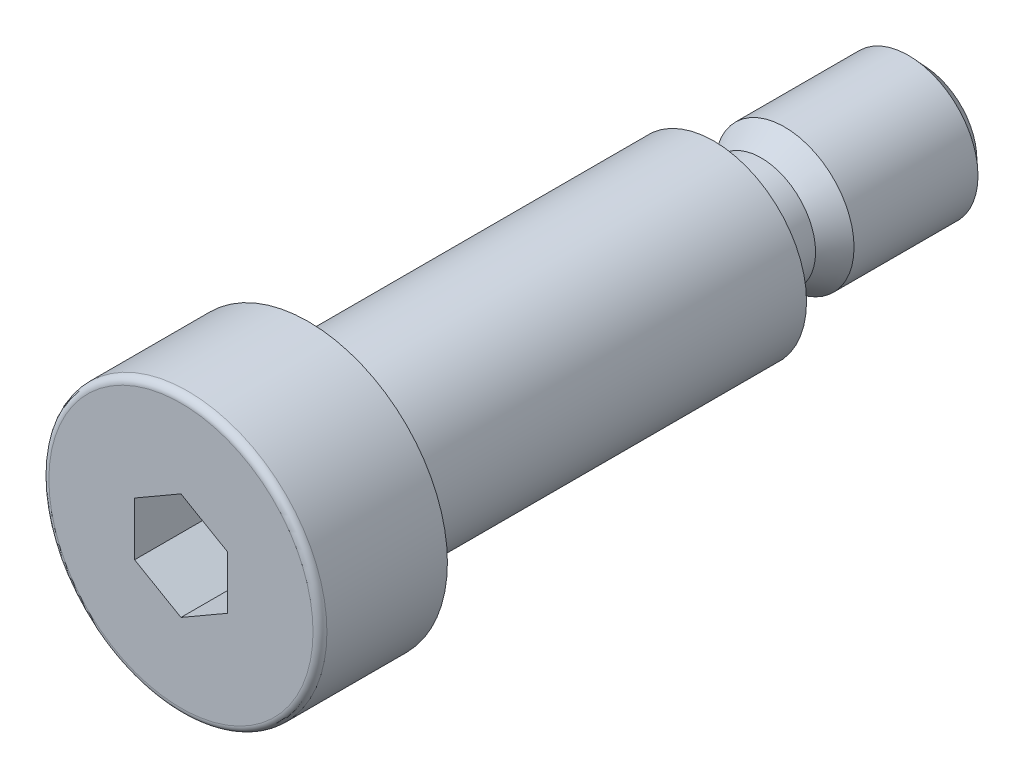
ISO-10303-21;
HEADER;
FILE_DESCRIPTION(('STEP AP214'),'2;1');
FILE_NAME('part.step','',(''),(''),'','','');
FILE_SCHEMA(('AUTOMOTIVE_DESIGN { 1 0 10303 214 1 1 1 1 }'));
ENDSEC;
DATA;
#1=APPLICATION_CONTEXT('core data for automotive mechanical design processes');
#2=APPLICATION_PROTOCOL_DEFINITION('international standard','automotive_design',2000,#1);
#3=PRODUCT_CONTEXT('',#1,'mechanical');
#4=PRODUCT('Part','Part','',(#3));
#5=PRODUCT_RELATED_PRODUCT_CATEGORY('part','',(#4));
#6=PRODUCT_DEFINITION_FORMATION('','',#4);
#7=PRODUCT_DEFINITION_CONTEXT('part definition',#1,'design');
#8=PRODUCT_DEFINITION('design','',#6,#7);
#9=PRODUCT_DEFINITION_SHAPE('','',#8);
#10=(LENGTH_UNIT() NAMED_UNIT(*) SI_UNIT(.MILLI.,.METRE.));
#11=(NAMED_UNIT(*) PLANE_ANGLE_UNIT() SI_UNIT($,.RADIAN.));
#12=(NAMED_UNIT(*) SI_UNIT($,.STERADIAN.) SOLID_ANGLE_UNIT());
#13=UNCERTAINTY_MEASURE_WITH_UNIT(LENGTH_MEASURE(1.E-05),#10,'distance_accuracy_value','');
#14=(GEOMETRIC_REPRESENTATION_CONTEXT(3) GLOBAL_UNCERTAINTY_ASSIGNED_CONTEXT((#13)) GLOBAL_UNIT_ASSIGNED_CONTEXT((#10,
#11,#12)) REPRESENTATION_CONTEXT('',''));
#15=CARTESIAN_POINT('',(0.,0.,0.));
#16=DIRECTION('',(0.,0.,1.));
#17=DIRECTION('',(1.,0.,0.));
#18=AXIS2_PLACEMENT_3D('',#15,#16,#17);
#19=CARTESIAN_POINT('',(0.,0.,28.5));
#20=DIRECTION('',(0.,0.,1.));
#21=DIRECTION('',(1.,0.,0.));
#22=AXIS2_PLACEMENT_3D('',#19,#20,#21);
#23=PLANE('',#22);
#24=CARTESIAN_POINT('',(0.,0.,28.5));
#25=DIRECTION('',(0.,0.,1.));
#26=DIRECTION('',(1.,0.,0.));
#27=AXIS2_PLACEMENT_3D('',#24,#25,#26);
#28=CIRCLE('',#27,11.4);
#29=CARTESIAN_POINT('',(11.4,0.,28.5));
#30=VERTEX_POINT('',#29);
#31=EDGE_CURVE('E42',#30,#30,#28,.T.);
#32=ORIENTED_EDGE('',*,*,#31,.T.);
#33=EDGE_LOOP('',(#32));
#34=FACE_BOUND('',#33,.T.);
#35=DIRECTION('',(0.,1.,0.));
#36=VECTOR('',#35,1.);
#37=CARTESIAN_POINT('',(4.,-2.30940107675851,28.5));
#38=LINE('',#37,#36);
#39=CARTESIAN_POINT('',(4.,-2.30940107675851,28.5));
#40=VERTEX_POINT('',#39);
#41=CARTESIAN_POINT('',(4.,2.3094010767585,28.5));
#42=VERTEX_POINT('',#41);
#43=EDGE_CURVE('E49',#40,#42,#38,.T.);
#44=ORIENTED_EDGE('',*,*,#43,.F.);
#45=DIRECTION('',(0.866025403784439,0.5,0.));
#46=VECTOR('',#45,1.);
#47=CARTESIAN_POINT('',(0.,-4.61880215351701,28.5));
#48=LINE('',#47,#46);
#49=CARTESIAN_POINT('',(0.,-4.61880215351701,28.5));
#50=VERTEX_POINT('',#49);
#51=EDGE_CURVE('E132',#50,#40,#48,.T.);
#52=ORIENTED_EDGE('',*,*,#51,.F.);
#53=DIRECTION('',(0.866025403784439,-0.5,0.));
#54=VECTOR('',#53,1.);
#55=CARTESIAN_POINT('',(-4.,-2.3094010767585,28.5));
#56=LINE('',#55,#54);
#57=CARTESIAN_POINT('',(-4.,-2.3094010767585,28.5));
#58=VERTEX_POINT('',#57);
#59=EDGE_CURVE('E130',#58,#50,#56,.T.);
#60=ORIENTED_EDGE('',*,*,#59,.F.);
#61=DIRECTION('',(0.,-1.,0.));
#62=VECTOR('',#61,1.);
#63=CARTESIAN_POINT('',(-4.,2.30940107675851,28.5));
#64=LINE('',#63,#62);
#65=CARTESIAN_POINT('',(-4.,2.30940107675851,28.5));
#66=VERTEX_POINT('',#65);
#67=EDGE_CURVE('E97',#66,#58,#64,.T.);
#68=ORIENTED_EDGE('',*,*,#67,.F.);
#69=DIRECTION('',(-0.866025403784439,-0.5,0.));
#70=VECTOR('',#69,1.);
#71=CARTESIAN_POINT('',(0.,4.61880215351701,28.5));
#72=LINE('',#71,#70);
#73=CARTESIAN_POINT('',(0.,4.61880215351701,28.5));
#74=VERTEX_POINT('',#73);
#75=EDGE_CURVE('E126',#74,#66,#72,.T.);
#76=ORIENTED_EDGE('',*,*,#75,.F.);
#77=DIRECTION('',(-0.866025403784439,0.5,0.));
#78=VECTOR('',#77,1.);
#79=CARTESIAN_POINT('',(4.,2.3094010767585,28.5));
#80=LINE('',#79,#78);
#81=EDGE_CURVE('E123',#42,#74,#80,.T.);
#82=ORIENTED_EDGE('',*,*,#81,.F.);
#83=EDGE_LOOP('',(#44,#52,#60,#68,#76,#82));
#84=FACE_BOUND('',#83,.T.);
#85=ADVANCED_FACE('F34',(#34,#84),#23,.T.);
#86=CARTESIAN_POINT('',(0.,0.,-35.5));
#87=DIRECTION('',(0.,0.,1.));
#88=DIRECTION('',(1.,0.,0.));
#89=AXIS2_PLACEMENT_3D('',#86,#87,#88);
#90=PLANE('',#89);
#91=CARTESIAN_POINT('',(0.,0.,-35.5));
#92=DIRECTION('',(0.,0.,1.));
#93=DIRECTION('',(1.,0.,0.));
#94=AXIS2_PLACEMENT_3D('',#91,#92,#93);
#95=CIRCLE('',#94,4.7);
#96=CARTESIAN_POINT('',(4.7,0.,-35.5));
#97=VERTEX_POINT('',#96);
#98=EDGE_CURVE('E162',#97,#97,#95,.T.);
#99=ORIENTED_EDGE('',*,*,#98,.F.);
#100=EDGE_LOOP('',(#99));
#101=FACE_BOUND('',#100,.T.);
#102=ADVANCED_FACE('F178',(#101),#90,.F.);
#103=CARTESIAN_POINT('',(0.,0.,-35.5));
#104=DIRECTION('',(0.,0.,1.));
#105=DIRECTION('',(1.,0.,0.));
#106=AXIS2_PLACEMENT_3D('',#103,#104,#105);
#107=CONICAL_SURFACE('',#106,4.7,0.825376850520736);
#108=CARTESIAN_POINT('',(0.,0.,-34.3));
#109=DIRECTION('',(0.,0.,1.));
#110=DIRECTION('',(1.,0.,0.));
#111=AXIS2_PLACEMENT_3D('',#108,#109,#110);
#112=CIRCLE('',#111,6.);
#113=CARTESIAN_POINT('',(6.,0.,-34.3));
#114=VERTEX_POINT('',#113);
#115=EDGE_CURVE('E159',#114,#114,#112,.T.);
#116=ORIENTED_EDGE('',*,*,#115,.F.);
#117=EDGE_LOOP('',(#116));
#118=FACE_BOUND('',#117,.T.);
#119=ORIENTED_EDGE('',*,*,#98,.T.);
#120=EDGE_LOOP('',(#119));
#121=FACE_BOUND('',#120,.T.);
#122=ADVANCED_FACE('F182',(#118,#121),#107,.T.);
#123=CARTESIAN_POINT('',(0.,0.,28.5));
#124=DIRECTION('',(0.,0.,1.));
#125=DIRECTION('',(1.,0.,0.));
#126=AXIS2_PLACEMENT_3D('',#123,#124,#125);
#127=CYLINDRICAL_SURFACE('',#126,6.);
#128=CARTESIAN_POINT('',(0.,0.,-23.6));
#129=DIRECTION('',(0.,0.,1.));
#130=DIRECTION('',(1.,0.,0.));
#131=AXIS2_PLACEMENT_3D('',#128,#129,#130);
#132=CIRCLE('',#131,6.);
#133=CARTESIAN_POINT('',(6.,0.,-23.6));
#134=VERTEX_POINT('',#133);
#135=EDGE_CURVE('E156',#134,#134,#132,.T.);
#136=ORIENTED_EDGE('',*,*,#135,.F.);
#137=EDGE_LOOP('',(#136));
#138=FACE_BOUND('',#137,.T.);
#139=ORIENTED_EDGE('',*,*,#115,.T.);
#140=EDGE_LOOP('',(#139));
#141=FACE_BOUND('',#140,.T.);
#142=ADVANCED_FACE('F188',(#138,#141),#127,.T.);
#143=CARTESIAN_POINT('',(0.,0.,-23.6));
#144=DIRECTION('',(0.,0.,-1.));
#145=DIRECTION('',(-1.,0.,0.));
#146=AXIS2_PLACEMENT_3D('',#143,#144,#145);
#147=CONICAL_SURFACE('',#146,6.,0.571837729916959);
#148=CARTESIAN_POINT('',(0.,0.,-21.58));
#149=DIRECTION('',(0.,0.,1.));
#150=DIRECTION('',(1.,0.,0.));
#151=AXIS2_PLACEMENT_3D('',#148,#149,#150);
#152=CIRCLE('',#151,4.7);
#153=CARTESIAN_POINT('',(4.7,0.,-21.58));
#154=VERTEX_POINT('',#153);
#155=EDGE_CURVE('E153',#154,#154,#152,.T.);
#156=ORIENTED_EDGE('',*,*,#155,.F.);
#157=EDGE_LOOP('',(#156));
#158=FACE_BOUND('',#157,.T.);
#159=ORIENTED_EDGE('',*,*,#135,.T.);
#160=EDGE_LOOP('',(#159));
#161=FACE_BOUND('',#160,.T.);
#162=ADVANCED_FACE('F192',(#158,#161),#147,.T.);
#163=CARTESIAN_POINT('',(0.,0.,28.5));
#164=DIRECTION('',(0.,0.,1.));
#165=DIRECTION('',(1.,0.,0.));
#166=AXIS2_PLACEMENT_3D('',#163,#164,#165);
#167=CYLINDRICAL_SURFACE('',#166,4.7);
#168=ORIENTED_EDGE('',*,*,#155,.T.);
#169=EDGE_LOOP('',(#168));
#170=FACE_BOUND('',#169,.T.);
#171=CARTESIAN_POINT('',(0.,0.,-17.5));
#172=DIRECTION('',(0.,0.,1.));
#173=DIRECTION('',(1.,0.,0.));
#174=AXIS2_PLACEMENT_3D('',#171,#172,#173);
#175=CIRCLE('',#174,4.7);
#176=CARTESIAN_POINT('',(4.7,0.,-17.5));
#177=VERTEX_POINT('',#176);
#178=EDGE_CURVE('E150',#177,#177,#175,.T.);
#179=ORIENTED_EDGE('',*,*,#178,.F.);
#180=EDGE_LOOP('',(#179));
#181=FACE_BOUND('',#180,.T.);
#182=ADVANCED_FACE('F196',(#170,#181),#167,.T.);
#183=CARTESIAN_POINT('',(0.,0.,-17.5));
#184=DIRECTION('',(0.,0.,1.));
#185=DIRECTION('',(1.,0.,0.));
#186=AXIS2_PLACEMENT_3D('',#183,#184,#185);
#187=PLANE('',#186);
#188=CARTESIAN_POINT('',(0.,0.,-17.5));
#189=DIRECTION('',(0.,0.,1.));
#190=DIRECTION('',(1.,0.,0.));
#191=AXIS2_PLACEMENT_3D('',#188,#189,#190);
#192=CIRCLE('',#191,7.99999999999999);
#193=CARTESIAN_POINT('',(7.99999999999999,0.,-17.5));
#194=VERTEX_POINT('',#193);
#195=EDGE_CURVE('E147',#194,#194,#192,.T.);
#196=ORIENTED_EDGE('',*,*,#195,.F.);
#197=EDGE_LOOP('',(#196));
#198=FACE_BOUND('',#197,.T.);
#199=ORIENTED_EDGE('',*,*,#178,.T.);
#200=EDGE_LOOP('',(#199));
#201=FACE_BOUND('',#200,.T.);
#202=ADVANCED_FACE('F200',(#198,#201),#187,.F.);
#203=CARTESIAN_POINT('',(0.,0.,28.5));
#204=DIRECTION('',(0.,0.,1.));
#205=DIRECTION('',(1.,0.,0.));
#206=AXIS2_PLACEMENT_3D('',#203,#204,#205);
#207=CYLINDRICAL_SURFACE('',#206,7.99999999999999);
#208=ORIENTED_EDGE('',*,*,#195,.T.);
#209=EDGE_LOOP('',(#208));
#210=FACE_BOUND('',#209,.T.);
#211=CARTESIAN_POINT('',(0.,0.,17.5));
#212=DIRECTION('',(0.,0.,1.));
#213=DIRECTION('',(1.,0.,0.));
#214=AXIS2_PLACEMENT_3D('',#211,#212,#213);
#215=CIRCLE('',#214,7.99999999999999);
#216=CARTESIAN_POINT('',(7.99999999999999,0.,17.5));
#217=VERTEX_POINT('',#216);
#218=EDGE_CURVE('E144',#217,#217,#215,.T.);
#219=ORIENTED_EDGE('',*,*,#218,.F.);
#220=EDGE_LOOP('',(#219));
#221=FACE_BOUND('',#220,.T.);
#222=ADVANCED_FACE('F204',(#210,#221),#207,.T.);
#223=CARTESIAN_POINT('',(0.,0.,17.5));
#224=DIRECTION('',(0.,0.,1.));
#225=DIRECTION('',(1.,0.,0.));
#226=AXIS2_PLACEMENT_3D('',#223,#224,#225);
#227=PLANE('',#226);
#228=CARTESIAN_POINT('',(0.,0.,17.5));
#229=DIRECTION('',(0.,0.,1.));
#230=DIRECTION('',(1.,0.,0.));
#231=AXIS2_PLACEMENT_3D('',#228,#229,#230);
#232=CIRCLE('',#231,12.);
#233=CARTESIAN_POINT('',(12.,0.,17.5));
#234=VERTEX_POINT('',#233);
#235=EDGE_CURVE('E136',#234,#234,#232,.T.);
#236=ORIENTED_EDGE('',*,*,#235,.F.);
#237=EDGE_LOOP('',(#236));
#238=FACE_BOUND('',#237,.T.);
#239=ORIENTED_EDGE('',*,*,#218,.T.);
#240=EDGE_LOOP('',(#239));
#241=FACE_BOUND('',#240,.T.);
#242=ADVANCED_FACE('F208',(#238,#241),#227,.F.);
#243=CARTESIAN_POINT('',(0.,0.,28.5));
#244=DIRECTION('',(0.,0.,1.));
#245=DIRECTION('',(1.,0.,0.));
#246=AXIS2_PLACEMENT_3D('',#243,#244,#245);
#247=CYLINDRICAL_SURFACE('',#246,12.);
#248=CARTESIAN_POINT('',(0.,0.,27.9));
#249=DIRECTION('',(0.,0.,1.));
#250=DIRECTION('',(1.,0.,0.));
#251=AXIS2_PLACEMENT_3D('',#248,#249,#250);
#252=CIRCLE('',#251,12.);
#253=CARTESIAN_POINT('',(12.,0.,27.9));
#254=VERTEX_POINT('',#253);
#255=EDGE_CURVE('E11',#254,#254,#252,.F.);
#256=ORIENTED_EDGE('',*,*,#255,.T.);
#257=EDGE_LOOP('',(#256));
#258=FACE_BOUND('',#257,.T.);
#259=ORIENTED_EDGE('',*,*,#235,.T.);
#260=EDGE_LOOP('',(#259));
#261=FACE_BOUND('',#260,.T.);
#262=ADVANCED_FACE('F212',(#258,#261),#247,.T.);
#263=CARTESIAN_POINT('',(4.,-2.30940107675851,21.9));
#264=DIRECTION('',(1.,0.,0.));
#265=DIRECTION('',(0.,0.,-1.));
#266=AXIS2_PLACEMENT_3D('',#263,#264,#265);
#267=PLANE('',#266);
#268=ORIENTED_EDGE('',*,*,#43,.T.);
#269=DIRECTION('',(0.,0.,1.));
#270=VECTOR('',#269,1.);
#271=CARTESIAN_POINT('',(4.,2.3094010767585,21.9));
#272=LINE('',#271,#270);
#273=CARTESIAN_POINT('',(4.,2.3094010767585,21.9));
#274=VERTEX_POINT('',#273);
#275=EDGE_CURVE('E79',#274,#42,#272,.T.);
#276=ORIENTED_EDGE('',*,*,#275,.F.);
#277=DIRECTION('',(0.,1.,0.));
#278=VECTOR('',#277,1.);
#279=CARTESIAN_POINT('',(4.,-2.30940107675851,21.9));
#280=LINE('',#279,#278);
#281=CARTESIAN_POINT('',(4.,-2.30940107675851,21.9));
#282=VERTEX_POINT('',#281);
#283=EDGE_CURVE('E134',#282,#274,#280,.T.);
#284=ORIENTED_EDGE('',*,*,#283,.F.);
#285=DIRECTION('',(0.,0.,1.));
#286=VECTOR('',#285,1.);
#287=CARTESIAN_POINT('',(4.,-2.30940107675851,21.9));
#288=LINE('',#287,#286);
#289=EDGE_CURVE('E57',#282,#40,#288,.T.);
#290=ORIENTED_EDGE('',*,*,#289,.T.);
#291=EDGE_LOOP('',(#268,#276,#284,#290));
#292=FACE_BOUND('',#291,.T.);
#293=ADVANCED_FACE('F216',(#292),#267,.F.);
#294=CARTESIAN_POINT('',(0.,-4.61880215351701,21.9));
#295=DIRECTION('',(0.5,-0.866025403784439,0.));
#296=DIRECTION('',(0.866025403784439,0.5,0.));
#297=AXIS2_PLACEMENT_3D('',#294,#295,#296);
#298=PLANE('',#297);
#299=ORIENTED_EDGE('',*,*,#51,.T.);
#300=ORIENTED_EDGE('',*,*,#289,.F.);
#301=DIRECTION('',(0.866025403784439,0.5,0.));
#302=VECTOR('',#301,1.);
#303=CARTESIAN_POINT('',(0.,-4.61880215351701,21.9));
#304=LINE('',#303,#302);
#305=CARTESIAN_POINT('',(0.,-4.61880215351701,21.9));
#306=VERTEX_POINT('',#305);
#307=EDGE_CURVE('E109',#306,#282,#304,.T.);
#308=ORIENTED_EDGE('',*,*,#307,.F.);
#309=DIRECTION('',(0.,0.,1.));
#310=VECTOR('',#309,1.);
#311=CARTESIAN_POINT('',(0.,-4.61880215351701,21.9));
#312=LINE('',#311,#310);
#313=EDGE_CURVE('E101',#306,#50,#312,.T.);
#314=ORIENTED_EDGE('',*,*,#313,.T.);
#315=EDGE_LOOP('',(#299,#300,#308,#314));
#316=FACE_BOUND('',#315,.T.);
#317=ADVANCED_FACE('F220',(#316),#298,.F.);
#318=CARTESIAN_POINT('',(-4.,-2.3094010767585,21.9));
#319=DIRECTION('',(-0.5,-0.866025403784439,0.));
#320=DIRECTION('',(0.866025403784439,-0.5,0.));
#321=AXIS2_PLACEMENT_3D('',#318,#319,#320);
#322=PLANE('',#321);
#323=ORIENTED_EDGE('',*,*,#59,.T.);
#324=ORIENTED_EDGE('',*,*,#313,.F.);
#325=DIRECTION('',(0.866025403784439,-0.5,0.));
#326=VECTOR('',#325,1.);
#327=CARTESIAN_POINT('',(-4.,-2.3094010767585,21.9));
#328=LINE('',#327,#326);
#329=CARTESIAN_POINT('',(-4.,-2.3094010767585,21.9));
#330=VERTEX_POINT('',#329);
#331=EDGE_CURVE('E105',#330,#306,#328,.T.);
#332=ORIENTED_EDGE('',*,*,#331,.F.);
#333=DIRECTION('',(0.,0.,1.));
#334=VECTOR('',#333,1.);
#335=CARTESIAN_POINT('',(-4.,-2.3094010767585,21.9));
#336=LINE('',#335,#334);
#337=EDGE_CURVE('E90',#330,#58,#336,.T.);
#338=ORIENTED_EDGE('',*,*,#337,.T.);
#339=EDGE_LOOP('',(#323,#324,#332,#338));
#340=FACE_BOUND('',#339,.T.);
#341=ADVANCED_FACE('F106',(#340),#322,.F.);
#342=CARTESIAN_POINT('',(-4.,2.30940107675851,21.9));
#343=DIRECTION('',(-1.,0.,0.));
#344=DIRECTION('',(0.,-1.,0.));
#345=AXIS2_PLACEMENT_3D('',#342,#343,#344);
#346=PLANE('',#345);
#347=ORIENTED_EDGE('',*,*,#67,.T.);
#348=ORIENTED_EDGE('',*,*,#337,.F.);
#349=DIRECTION('',(0.,-1.,0.));
#350=VECTOR('',#349,1.);
#351=CARTESIAN_POINT('',(-4.,2.30940107675851,21.9));
#352=LINE('',#351,#350);
#353=CARTESIAN_POINT('',(-4.,2.30940107675851,21.9));
#354=VERTEX_POINT('',#353);
#355=EDGE_CURVE('E94',#354,#330,#352,.T.);
#356=ORIENTED_EDGE('',*,*,#355,.F.);
#357=DIRECTION('',(0.,0.,1.));
#358=VECTOR('',#357,1.);
#359=CARTESIAN_POINT('',(-4.,2.30940107675851,21.9));
#360=LINE('',#359,#358);
#361=EDGE_CURVE('E102',#354,#66,#360,.T.);
#362=ORIENTED_EDGE('',*,*,#361,.T.);
#363=EDGE_LOOP('',(#347,#348,#356,#362));
#364=FACE_BOUND('',#363,.T.);
#365=ADVANCED_FACE('F92',(#364),#346,.F.);
#366=CARTESIAN_POINT('',(0.,4.61880215351701,21.9));
#367=DIRECTION('',(-0.5,0.866025403784439,0.));
#368=DIRECTION('',(-0.866025403784439,-0.5,0.));
#369=AXIS2_PLACEMENT_3D('',#366,#367,#368);
#370=PLANE('',#369);
#371=ORIENTED_EDGE('',*,*,#75,.T.);
#372=ORIENTED_EDGE('',*,*,#361,.F.);
#373=DIRECTION('',(-0.866025403784439,-0.5,0.));
#374=VECTOR('',#373,1.);
#375=CARTESIAN_POINT('',(0.,4.61880215351701,21.9));
#376=LINE('',#375,#374);
#377=CARTESIAN_POINT('',(0.,4.61880215351701,21.9));
#378=VERTEX_POINT('',#377);
#379=EDGE_CURVE('E115',#378,#354,#376,.T.);
#380=ORIENTED_EDGE('',*,*,#379,.F.);
#381=DIRECTION('',(0.,0.,1.));
#382=VECTOR('',#381,1.);
#383=CARTESIAN_POINT('',(0.,4.61880215351701,21.9));
#384=LINE('',#383,#382);
#385=EDGE_CURVE('E139',#378,#74,#384,.T.);
#386=ORIENTED_EDGE('',*,*,#385,.T.);
#387=EDGE_LOOP('',(#371,#372,#380,#386));
#388=FACE_BOUND('',#387,.T.);
#389=ADVANCED_FACE('F223',(#388),#370,.F.);
#390=CARTESIAN_POINT('',(4.,2.3094010767585,21.9));
#391=DIRECTION('',(0.5,0.866025403784439,0.));
#392=DIRECTION('',(-0.866025403784439,0.5,0.));
#393=AXIS2_PLACEMENT_3D('',#390,#391,#392);
#394=PLANE('',#393);
#395=ORIENTED_EDGE('',*,*,#81,.T.);
#396=ORIENTED_EDGE('',*,*,#385,.F.);
#397=DIRECTION('',(-0.866025403784439,0.5,0.));
#398=VECTOR('',#397,1.);
#399=CARTESIAN_POINT('',(4.,2.3094010767585,21.9));
#400=LINE('',#399,#398);
#401=EDGE_CURVE('E117',#274,#378,#400,.T.);
#402=ORIENTED_EDGE('',*,*,#401,.F.);
#403=ORIENTED_EDGE('',*,*,#275,.T.);
#404=EDGE_LOOP('',(#395,#396,#402,#403));
#405=FACE_BOUND('',#404,.T.);
#406=ADVANCED_FACE('F174',(#405),#394,.F.);
#407=CARTESIAN_POINT('',(0.,0.,21.9));
#408=DIRECTION('',(0.,0.,1.));
#409=DIRECTION('',(1.,0.,0.));
#410=AXIS2_PLACEMENT_3D('',#407,#408,#409);
#411=PLANE('',#410);
#412=ORIENTED_EDGE('',*,*,#283,.T.);
#413=ORIENTED_EDGE('',*,*,#401,.T.);
#414=ORIENTED_EDGE('',*,*,#379,.T.);
#415=ORIENTED_EDGE('',*,*,#355,.T.);
#416=ORIENTED_EDGE('',*,*,#331,.T.);
#417=ORIENTED_EDGE('',*,*,#307,.T.);
#418=EDGE_LOOP('',(#412,#413,#414,#415,#416,#417));
#419=FACE_BOUND('',#418,.T.);
#420=ADVANCED_FACE('F112',(#419),#411,.T.);
#421=CARTESIAN_POINT('',(0.,0.,27.9));
#422=DIRECTION('',(0.,0.,1.));
#423=DIRECTION('',(1.,0.,0.));
#424=AXIS2_PLACEMENT_3D('',#421,#422,#423);
#425=TOROIDAL_SURFACE('',#424,11.4,0.6);
#426=ORIENTED_EDGE('',*,*,#255,.F.);
#427=EDGE_LOOP('',(#426));
#428=FACE_BOUND('',#427,.T.);
#429=ORIENTED_EDGE('',*,*,#31,.F.);
#430=EDGE_LOOP('',(#429));
#431=FACE_BOUND('',#430,.T.);
#432=ADVANCED_FACE('F36',(#428,#431),#425,.T.);
#433=CLOSED_SHELL('',(#85,#102,#122,#142,#162,#182,#202,#222,#242,#262,#293,#317,#341,#365,#389,
#406,#420,#432));
#434=MANIFOLD_SOLID_BREP('B2',#433);
#435=ADVANCED_BREP_SHAPE_REPRESENTATION('',(#18,#434),#14);
#436=SHAPE_DEFINITION_REPRESENTATION(#9,#435);
ENDSEC;
END-ISO-10303-21;
